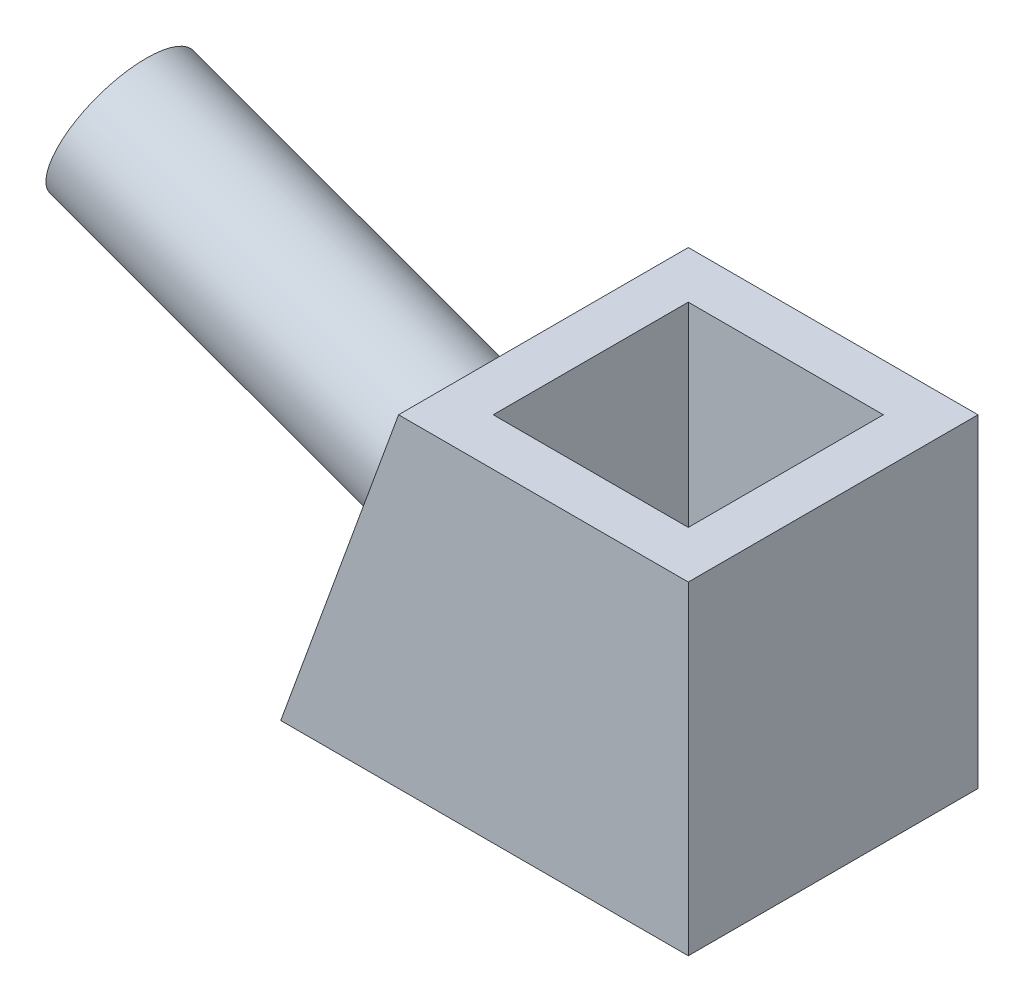
ISO-10303-21;
HEADER;
FILE_DESCRIPTION(('STEP AP214'),'2;1');
FILE_NAME('part.step','',(''),(''),'','','');
FILE_SCHEMA(('AUTOMOTIVE_DESIGN { 1 0 10303 214 1 1 1 1 }'));
ENDSEC;
DATA;
#1=APPLICATION_CONTEXT('core data for automotive mechanical design processes');
#2=APPLICATION_PROTOCOL_DEFINITION('international standard','automotive_design',2000,#1);
#3=PRODUCT_CONTEXT('',#1,'mechanical');
#4=PRODUCT('Part','Part','',(#3));
#5=PRODUCT_RELATED_PRODUCT_CATEGORY('part','',(#4));
#6=PRODUCT_DEFINITION_FORMATION('','',#4);
#7=PRODUCT_DEFINITION_CONTEXT('part definition',#1,'design');
#8=PRODUCT_DEFINITION('design','',#6,#7);
#9=PRODUCT_DEFINITION_SHAPE('','',#8);
#10=(LENGTH_UNIT() NAMED_UNIT(*) SI_UNIT(.MILLI.,.METRE.));
#11=(NAMED_UNIT(*) PLANE_ANGLE_UNIT() SI_UNIT($,.RADIAN.));
#12=(NAMED_UNIT(*) SI_UNIT($,.STERADIAN.) SOLID_ANGLE_UNIT());
#13=UNCERTAINTY_MEASURE_WITH_UNIT(LENGTH_MEASURE(1.E-05),#10,'distance_accuracy_value','');
#14=(GEOMETRIC_REPRESENTATION_CONTEXT(3) GLOBAL_UNCERTAINTY_ASSIGNED_CONTEXT((#13)) GLOBAL_UNIT_ASSIGNED_CONTEXT((#10,
#11,#12)) REPRESENTATION_CONTEXT('',''));
#15=CARTESIAN_POINT('',(0.,0.,0.));
#16=DIRECTION('',(0.,0.,1.));
#17=DIRECTION('',(1.,0.,0.));
#18=AXIS2_PLACEMENT_3D('',#15,#16,#17);
#19=CARTESIAN_POINT('',(0.,42.5694094,0.));
#20=DIRECTION('',(0.,0.,-1.));
#21=DIRECTION('',(-1.,0.,0.));
#22=AXIS2_PLACEMENT_3D('',#19,#20,#21);
#23=PLANE('',#22);
#24=DIRECTION('',(-0.342020143325665,-0.93969262078591,0.));
#25=VECTOR('',#24,1.);
#26=CARTESIAN_POINT('',(1.84384601293396E-06,-6.7110506527837E-07,0.));
#27=LINE('',#26,#25);
#28=CARTESIAN_POINT('',(15.494,42.5694094,0.));
#29=VERTEX_POINT('',#28);
#30=CARTESIAN_POINT('',(0.,0.,0.));
#31=VERTEX_POINT('',#30);
#32=EDGE_CURVE('E139',#29,#31,#27,.T.);
#33=ORIENTED_EDGE('',*,*,#32,.T.);
#34=DIRECTION('',(1.,0.,0.));
#35=VECTOR('',#34,1.);
#36=CARTESIAN_POINT('',(0.,0.,0.));
#37=LINE('',#36,#35);
#38=CARTESIAN_POINT('',(53.594,0.,0.));
#39=VERTEX_POINT('',#38);
#40=EDGE_CURVE('E161',#31,#39,#37,.T.);
#41=ORIENTED_EDGE('',*,*,#40,.T.);
#42=DIRECTION('',(0.,-1.,0.));
#43=VECTOR('',#42,1.);
#44=CARTESIAN_POINT('',(53.594,42.5694094,0.));
#45=LINE('',#44,#43);
#46=CARTESIAN_POINT('',(53.594,42.5694094,0.));
#47=VERTEX_POINT('',#46);
#48=EDGE_CURVE('E42',#47,#39,#45,.T.);
#49=ORIENTED_EDGE('',*,*,#48,.F.);
#50=DIRECTION('',(1.,0.,0.));
#51=VECTOR('',#50,1.);
#52=CARTESIAN_POINT('',(0.,42.5694094,0.));
#53=LINE('',#52,#51);
#54=EDGE_CURVE('E151',#29,#47,#53,.T.);
#55=ORIENTED_EDGE('',*,*,#54,.F.);
#56=EDGE_LOOP('',(#33,#41,#49,#55));
#57=FACE_BOUND('',#56,.T.);
#58=ADVANCED_FACE('F39',(#57),#23,.F.);
#59=CARTESIAN_POINT('',(0.,42.5694094,-38.1));
#60=DIRECTION('',(0.,0.,1.));
#61=DIRECTION('',(1.,0.,0.));
#62=AXIS2_PLACEMENT_3D('',#59,#60,#61);
#63=PLANE('',#62);
#64=DIRECTION('',(-0.342020143325665,-0.93969262078591,0.));
#65=VECTOR('',#64,1.);
#66=CARTESIAN_POINT('',(1.84384601293396E-06,-6.7110506527837E-07,-38.1));
#67=LINE('',#66,#65);
#68=CARTESIAN_POINT('',(15.494,42.5694094,-38.1));
#69=VERTEX_POINT('',#68);
#70=CARTESIAN_POINT('',(0.,0.,-38.1));
#71=VERTEX_POINT('',#70);
#72=EDGE_CURVE('E143',#69,#71,#67,.T.);
#73=ORIENTED_EDGE('',*,*,#72,.F.);
#74=DIRECTION('',(-1.,0.,0.));
#75=VECTOR('',#74,1.);
#76=CARTESIAN_POINT('',(0.,42.5694094,-38.1));
#77=LINE('',#76,#75);
#78=CARTESIAN_POINT('',(53.594,42.5694094,-38.1));
#79=VERTEX_POINT('',#78);
#80=EDGE_CURVE('E156',#79,#69,#77,.T.);
#81=ORIENTED_EDGE('',*,*,#80,.F.);
#82=DIRECTION('',(0.,-1.,0.));
#83=VECTOR('',#82,1.);
#84=CARTESIAN_POINT('',(53.594,42.5694094,-38.1));
#85=LINE('',#84,#83);
#86=CARTESIAN_POINT('',(53.594,0.,-38.1));
#87=VERTEX_POINT('',#86);
#88=EDGE_CURVE('E159',#79,#87,#85,.T.);
#89=ORIENTED_EDGE('',*,*,#88,.T.);
#90=DIRECTION('',(-1.,0.,0.));
#91=VECTOR('',#90,1.);
#92=CARTESIAN_POINT('',(0.,0.,-38.1));
#93=LINE('',#92,#91);
#94=EDGE_CURVE('E154',#87,#71,#93,.T.);
#95=ORIENTED_EDGE('',*,*,#94,.T.);
#96=EDGE_LOOP('',(#73,#81,#89,#95));
#97=FACE_BOUND('',#96,.T.);
#98=ADVANCED_FACE('F182',(#97),#63,.F.);
#99=CARTESIAN_POINT('',(0.,42.5694094,0.));
#100=DIRECTION('',(0.,-1.,0.));
#101=DIRECTION('',(0.,0.,-1.));
#102=AXIS2_PLACEMENT_3D('',#99,#100,#101);
#103=PLANE('',#102);
#104=DIRECTION('',(1.,0.,0.));
#105=VECTOR('',#104,1.);
#106=CARTESIAN_POINT('',(47.371,42.5694094,-6.223));
#107=LINE('',#106,#105);
#108=CARTESIAN_POINT('',(21.717,42.5694094,-6.223));
#109=VERTEX_POINT('',#108);
#110=CARTESIAN_POINT('',(47.371,42.5694094,-6.223));
#111=VERTEX_POINT('',#110);
#112=EDGE_CURVE('E132',#109,#111,#107,.T.);
#113=ORIENTED_EDGE('',*,*,#112,.F.);
#114=DIRECTION('',(0.,0.,1.));
#115=VECTOR('',#114,1.);
#116=CARTESIAN_POINT('',(21.717,42.5694094,-31.877));
#117=LINE('',#116,#115);
#118=CARTESIAN_POINT('',(21.717,42.5694094,-31.877));
#119=VERTEX_POINT('',#118);
#120=EDGE_CURVE('E54',#119,#109,#117,.T.);
#121=ORIENTED_EDGE('',*,*,#120,.F.);
#122=DIRECTION('',(-1.,0.,0.));
#123=VECTOR('',#122,1.);
#124=CARTESIAN_POINT('',(47.371,42.5694094,-31.877));
#125=LINE('',#124,#123);
#126=CARTESIAN_POINT('',(47.371,42.5694094,-31.877));
#127=VERTEX_POINT('',#126);
#128=EDGE_CURVE('E122',#127,#119,#125,.T.);
#129=ORIENTED_EDGE('',*,*,#128,.F.);
#130=DIRECTION('',(0.,0.,-1.));
#131=VECTOR('',#130,1.);
#132=CARTESIAN_POINT('',(47.371,42.5694094,-31.877));
#133=LINE('',#132,#131);
#134=EDGE_CURVE('E125',#111,#127,#133,.T.);
#135=ORIENTED_EDGE('',*,*,#134,.F.);
#136=EDGE_LOOP('',(#113,#121,#129,#135));
#137=FACE_BOUND('',#136,.T.);
#138=DIRECTION('',(0.,0.,1.));
#139=VECTOR('',#138,1.);
#140=CARTESIAN_POINT('',(15.494,42.5694094,-38.1));
#141=LINE('',#140,#139);
#142=EDGE_CURVE('E145',#69,#29,#141,.T.);
#143=ORIENTED_EDGE('',*,*,#142,.T.);
#144=ORIENTED_EDGE('',*,*,#54,.T.);
#145=DIRECTION('',(0.,0.,-1.));
#146=VECTOR('',#145,1.);
#147=CARTESIAN_POINT('',(53.594,42.5694094,0.));
#148=LINE('',#147,#146);
#149=EDGE_CURVE('E153',#47,#79,#148,.T.);
#150=ORIENTED_EDGE('',*,*,#149,.T.);
#151=ORIENTED_EDGE('',*,*,#80,.T.);
#152=EDGE_LOOP('',(#143,#144,#150,#151));
#153=FACE_BOUND('',#152,.T.);
#154=ADVANCED_FACE('F185',(#137,#153),#103,.F.);
#155=CARTESIAN_POINT('',(53.594,42.5694094,0.));
#156=DIRECTION('',(-1.,0.,0.));
#157=DIRECTION('',(0.,0.,1.));
#158=AXIS2_PLACEMENT_3D('',#155,#156,#157);
#159=PLANE('',#158);
#160=DIRECTION('',(0.,0.,-1.));
#161=VECTOR('',#160,1.);
#162=CARTESIAN_POINT('',(53.594,0.,0.));
#163=LINE('',#162,#161);
#164=EDGE_CURVE('E163',#39,#87,#163,.T.);
#165=ORIENTED_EDGE('',*,*,#164,.T.);
#166=ORIENTED_EDGE('',*,*,#88,.F.);
#167=ORIENTED_EDGE('',*,*,#149,.F.);
#168=ORIENTED_EDGE('',*,*,#48,.T.);
#169=EDGE_LOOP('',(#165,#166,#167,#168));
#170=FACE_BOUND('',#169,.T.);
#171=ADVANCED_FACE('F176',(#170),#159,.F.);
#172=CARTESIAN_POINT('',(0.,0.,0.));
#173=DIRECTION('',(0.,-1.,0.));
#174=DIRECTION('',(0.,0.,-1.));
#175=AXIS2_PLACEMENT_3D('',#172,#173,#174);
#176=PLANE('',#175);
#177=DIRECTION('',(0.,0.,1.));
#178=VECTOR('',#177,1.);
#179=CARTESIAN_POINT('',(21.717,0.,-31.877));
#180=LINE('',#179,#178);
#181=CARTESIAN_POINT('',(21.717,0.,-31.877));
#182=VERTEX_POINT('',#181);
#183=CARTESIAN_POINT('',(21.717,0.,-6.223));
#184=VERTEX_POINT('',#183);
#185=EDGE_CURVE('E106',#182,#184,#180,.T.);
#186=ORIENTED_EDGE('',*,*,#185,.T.);
#187=DIRECTION('',(1.,0.,0.));
#188=VECTOR('',#187,1.);
#189=CARTESIAN_POINT('',(47.371,0.,-6.223));
#190=LINE('',#189,#188);
#191=CARTESIAN_POINT('',(47.371,0.,-6.223));
#192=VERTEX_POINT('',#191);
#193=EDGE_CURVE('E115',#184,#192,#190,.T.);
#194=ORIENTED_EDGE('',*,*,#193,.T.);
#195=DIRECTION('',(0.,0.,-1.));
#196=VECTOR('',#195,1.);
#197=CARTESIAN_POINT('',(47.371,0.,-31.877));
#198=LINE('',#197,#196);
#199=CARTESIAN_POINT('',(47.371,0.,-31.877));
#200=VERTEX_POINT('',#199);
#201=EDGE_CURVE('E62',#192,#200,#198,.T.);
#202=ORIENTED_EDGE('',*,*,#201,.T.);
#203=DIRECTION('',(-1.,0.,0.));
#204=VECTOR('',#203,1.);
#205=CARTESIAN_POINT('',(47.371,0.,-31.877));
#206=LINE('',#205,#204);
#207=EDGE_CURVE('E112',#200,#182,#206,.T.);
#208=ORIENTED_EDGE('',*,*,#207,.T.);
#209=EDGE_LOOP('',(#186,#194,#202,#208));
#210=FACE_BOUND('',#209,.T.);
#211=DIRECTION('',(0.,0.,1.));
#212=VECTOR('',#211,1.);
#213=CARTESIAN_POINT('',(0.,0.,0.));
#214=LINE('',#213,#212);
#215=EDGE_CURVE('E150',#71,#31,#214,.T.);
#216=ORIENTED_EDGE('',*,*,#215,.F.);
#217=ORIENTED_EDGE('',*,*,#94,.F.);
#218=ORIENTED_EDGE('',*,*,#164,.F.);
#219=ORIENTED_EDGE('',*,*,#40,.F.);
#220=EDGE_LOOP('',(#216,#217,#218,#219));
#221=FACE_BOUND('',#220,.T.);
#222=ADVANCED_FACE('F119',(#210,#221),#176,.T.);
#223=CARTESIAN_POINT('',(1.84384601293396E-06,-6.7110506527837E-07,-38.1));
#224=DIRECTION('',(-0.93969262078591,0.342020143325665,0.));
#225=DIRECTION('',(-0.342020143325665,-0.93969262078591,0.));
#226=AXIS2_PLACEMENT_3D('',#223,#224,#225);
#227=PLANE('',#226);
#228=CARTESIAN_POINT('',(7.74699907807699,21.2847050355525,-19.05));
#229=DIRECTION('',(-0.93969262078591,0.342020143325666,0.));
#230=DIRECTION('',(-0.342020143325666,-0.93969262078591,0.));
#231=AXIS2_PLACEMENT_3D('',#228,#229,#230);
#232=CIRCLE('',#231,9.4107);
#233=CARTESIAN_POINT('',(10.9656480408718,30.1278703819825,-19.05));
#234=VERTEX_POINT('',#233);
#235=EDGE_CURVE('E11',#234,#234,#232,.T.);
#236=ORIENTED_EDGE('',*,*,#235,.F.);
#237=EDGE_LOOP('',(#236));
#238=FACE_BOUND('',#237,.T.);
#239=ORIENTED_EDGE('',*,*,#32,.F.);
#240=ORIENTED_EDGE('',*,*,#142,.F.);
#241=ORIENTED_EDGE('',*,*,#72,.T.);
#242=ORIENTED_EDGE('',*,*,#215,.T.);
#243=EDGE_LOOP('',(#239,#240,#241,#242));
#244=FACE_BOUND('',#243,.T.);
#245=ADVANCED_FACE('F186',(#238,#244),#227,.T.);
#246=CARTESIAN_POINT('',(21.717,0.,-31.877));
#247=DIRECTION('',(-1.,0.,0.));
#248=DIRECTION('',(0.,0.,1.));
#249=AXIS2_PLACEMENT_3D('',#246,#247,#248);
#250=PLANE('',#249);
#251=ORIENTED_EDGE('',*,*,#120,.T.);
#252=DIRECTION('',(0.,1.,0.));
#253=VECTOR('',#252,1.);
#254=CARTESIAN_POINT('',(21.717,0.,-6.223));
#255=LINE('',#254,#253);
#256=EDGE_CURVE('E102',#184,#109,#255,.T.);
#257=ORIENTED_EDGE('',*,*,#256,.F.);
#258=ORIENTED_EDGE('',*,*,#185,.F.);
#259=DIRECTION('',(0.,1.,0.));
#260=VECTOR('',#259,1.);
#261=CARTESIAN_POINT('',(21.717,0.,-31.877));
#262=LINE('',#261,#260);
#263=EDGE_CURVE('E137',#182,#119,#262,.T.);
#264=ORIENTED_EDGE('',*,*,#263,.T.);
#265=EDGE_LOOP('',(#251,#257,#258,#264));
#266=FACE_BOUND('',#265,.T.);
#267=ADVANCED_FACE('F104',(#266),#250,.F.);
#268=CARTESIAN_POINT('',(47.371,0.,-31.877));
#269=DIRECTION('',(0.,0.,-1.));
#270=DIRECTION('',(-1.,0.,0.));
#271=AXIS2_PLACEMENT_3D('',#268,#269,#270);
#272=PLANE('',#271);
#273=ORIENTED_EDGE('',*,*,#128,.T.);
#274=ORIENTED_EDGE('',*,*,#263,.F.);
#275=ORIENTED_EDGE('',*,*,#207,.F.);
#276=DIRECTION('',(0.,1.,0.));
#277=VECTOR('',#276,1.);
#278=CARTESIAN_POINT('',(47.371,0.,-31.877));
#279=LINE('',#278,#277);
#280=EDGE_CURVE('E140',#200,#127,#279,.T.);
#281=ORIENTED_EDGE('',*,*,#280,.T.);
#282=EDGE_LOOP('',(#273,#274,#275,#281));
#283=FACE_BOUND('',#282,.T.);
#284=ADVANCED_FACE('F194',(#283),#272,.F.);
#285=CARTESIAN_POINT('',(47.371,0.,-31.877));
#286=DIRECTION('',(1.,0.,0.));
#287=DIRECTION('',(0.,0.,-1.));
#288=AXIS2_PLACEMENT_3D('',#285,#286,#287);
#289=PLANE('',#288);
#290=ORIENTED_EDGE('',*,*,#134,.T.);
#291=ORIENTED_EDGE('',*,*,#280,.F.);
#292=ORIENTED_EDGE('',*,*,#201,.F.);
#293=DIRECTION('',(0.,1.,0.));
#294=VECTOR('',#293,1.);
#295=CARTESIAN_POINT('',(47.371,0.,-6.223));
#296=LINE('',#295,#294);
#297=EDGE_CURVE('E111',#192,#111,#296,.T.);
#298=ORIENTED_EDGE('',*,*,#297,.T.);
#299=EDGE_LOOP('',(#290,#291,#292,#298));
#300=FACE_BOUND('',#299,.T.);
#301=ADVANCED_FACE('F238',(#300),#289,.F.);
#302=CARTESIAN_POINT('',(47.371,0.,-6.223));
#303=DIRECTION('',(0.,0.,1.));
#304=DIRECTION('',(1.,0.,0.));
#305=AXIS2_PLACEMENT_3D('',#302,#303,#304);
#306=PLANE('',#305);
#307=ORIENTED_EDGE('',*,*,#112,.T.);
#308=ORIENTED_EDGE('',*,*,#297,.F.);
#309=ORIENTED_EDGE('',*,*,#193,.F.);
#310=ORIENTED_EDGE('',*,*,#256,.T.);
#311=EDGE_LOOP('',(#307,#308,#309,#310));
#312=FACE_BOUND('',#311,.T.);
#313=ADVANCED_FACE('F116',(#312),#306,.F.);
#314=CARTESIAN_POINT('',(-39.9893860578472,38.6593283164963,-19.05));
#315=DIRECTION('',(0.939692620785909,-0.342020143325666,0.));
#316=DIRECTION('',(0.342020143325666,0.93969262078591,0.));
#317=AXIS2_PLACEMENT_3D('',#314,#315,#316);
#318=CYLINDRICAL_SURFACE('',#317,9.4107);
#319=CARTESIAN_POINT('',(-39.9893860578472,38.6593283164963,-19.05));
#320=DIRECTION('',(-0.93969262078591,0.342020143325666,0.));
#321=DIRECTION('',(-0.342020143325666,-0.93969262078591,0.));
#322=AXIS2_PLACEMENT_3D('',#319,#320,#321);
#323=CIRCLE('',#322,9.4107);
#324=CARTESIAN_POINT('',(-36.7707370950524,47.5024936629263,-19.05));
#325=VERTEX_POINT('',#324);
#326=EDGE_CURVE('E133',#325,#325,#323,.T.);
#327=CARTESIAN_POINT('',(-36.7707370950524,47.5024936629263,-19.05));
#328=CARTESIAN_POINT('',(-36.2734830832198,47.3215080037498,-19.05));
#329=CARTESIAN_POINT('',(-35.7762290713873,47.1405223445733,-19.05));
#330=CARTESIAN_POINT('',(-34.7817210477222,46.7785510262203,-19.05));
#331=CARTESIAN_POINT('',(-34.2844670358896,46.5975653670438,-19.05));
#332=CARTESIAN_POINT('',(-33.2899590122246,46.2355940486908,-19.05));
#333=CARTESIAN_POINT('',(-32.792705000392,46.0546083895143,-19.05));
#334=CARTESIAN_POINT('',(-31.7981969767269,45.6926370711613,-19.05));
#335=CARTESIAN_POINT('',(-31.3009429648944,45.5116514119848,-19.05));
#336=CARTESIAN_POINT('',(-30.3064349412293,45.1496800936318,-19.05));
#337=CARTESIAN_POINT('',(-29.8091809293968,44.9686944344553,-19.05));
#338=CARTESIAN_POINT('',(-28.8146729057317,44.6067231161023,-19.05));
#339=CARTESIAN_POINT('',(-28.3174188938991,44.4257374569258,-19.05));
#340=CARTESIAN_POINT('',(-27.322910870234,44.0637661385728,-19.05));
#341=CARTESIAN_POINT('',(-26.8256568584015,43.8827804793964,-19.05));
#342=CARTESIAN_POINT('',(-25.8311488347364,43.5208091610434,-19.05));
#343=CARTESIAN_POINT('',(-25.3338948229039,43.3398235018669,-19.05));
#344=CARTESIAN_POINT('',(-24.3393867992388,42.9778521835139,-19.05));
#345=CARTESIAN_POINT('',(-23.8421327874062,42.7968665243374,-19.05));
#346=CARTESIAN_POINT('',(-22.8476247637411,42.4348952059844,-19.05));
#347=CARTESIAN_POINT('',(-22.3503707519086,42.2539095468079,-19.05));
#348=CARTESIAN_POINT('',(-21.3558627282435,41.8919382284549,-19.05));
#349=CARTESIAN_POINT('',(-20.858608716411,41.7109525692784,-19.05));
#350=CARTESIAN_POINT('',(-19.8641006927459,41.3489812509254,-19.05));
#351=CARTESIAN_POINT('',(-19.3668466809133,41.1679955917489,-19.05));
#352=CARTESIAN_POINT('',(-18.3723386572482,40.8060242733959,-19.05));
#353=CARTESIAN_POINT('',(-17.8750846454157,40.6250386142194,-19.05));
#354=CARTESIAN_POINT('',(-16.8805766217506,40.2630672958664,-19.05));
#355=CARTESIAN_POINT('',(-16.3833226099181,40.0820816366899,-19.05));
#356=CARTESIAN_POINT('',(-15.388814586253,39.7201103183369,-19.05));
#357=CARTESIAN_POINT('',(-14.8915605744204,39.5391246591604,-19.05));
#358=CARTESIAN_POINT('',(-13.8970525507554,39.1771533408074,-19.05));
#359=CARTESIAN_POINT('',(-13.3997985389228,38.9961676816309,-19.05));
#360=CARTESIAN_POINT('',(-12.4052905152577,38.6341963632779,-19.05));
#361=CARTESIAN_POINT('',(-11.9080365034252,38.4532107041014,-19.05));
#362=CARTESIAN_POINT('',(-10.9135284797601,38.0912393857484,-19.05));
#363=CARTESIAN_POINT('',(-10.4162744679276,37.9102537265719,-19.05));
#364=CARTESIAN_POINT('',(-9.42176644426246,37.5482824082189,-19.05));
#365=CARTESIAN_POINT('',(-8.92451243242992,37.3672967490424,-19.05));
#366=CARTESIAN_POINT('',(-7.93000440876483,37.0053254306894,-19.05));
#367=CARTESIAN_POINT('',(-7.43275039693229,36.8243397715129,-19.05));
#368=CARTESIAN_POINT('',(-6.4382423732672,36.4623684531599,-19.05));
#369=CARTESIAN_POINT('',(-5.94098836143465,36.2813827939834,-19.05));
#370=CARTESIAN_POINT('',(-4.94648033776956,35.9194114756304,-19.05));
#371=CARTESIAN_POINT('',(-4.44922632593702,35.7384258164539,-19.05));
#372=CARTESIAN_POINT('',(-3.45471830227193,35.3764544981009,-19.05));
#373=CARTESIAN_POINT('',(-2.95746429043939,35.1954688389244,-19.05));
#374=CARTESIAN_POINT('',(-1.9629562667743,34.8334975205714,-19.05));
#375=CARTESIAN_POINT('',(-1.46570225494176,34.652511861395,-19.05));
#376=CARTESIAN_POINT('',(-0.471194231276672,34.290540543042,-19.05));
#377=CARTESIAN_POINT('',(0.0260597805558715,34.1095548838655,-19.05));
#378=CARTESIAN_POINT('',(1.02056780422096,33.7475835655125,-19.05));
#379=CARTESIAN_POINT('',(1.5178218160535,33.566597906336,-19.05));
#380=CARTESIAN_POINT('',(2.51232983971859,33.204626587983,-19.05));
#381=CARTESIAN_POINT('',(3.00958385155114,33.0236409288065,-19.05));
#382=CARTESIAN_POINT('',(4.00409187521623,32.6616696104535,-19.05));
#383=CARTESIAN_POINT('',(4.50134588704877,32.480683951277,-19.05));
#384=CARTESIAN_POINT('',(5.49585391071385,32.118712632924,-19.05));
#385=CARTESIAN_POINT('',(5.9931079225464,31.9377269737475,-19.05));
#386=CARTESIAN_POINT('',(6.98761594621149,31.5757556553945,-19.05));
#387=CARTESIAN_POINT('',(7.48486995804403,31.394769996218,-19.05));
#388=CARTESIAN_POINT('',(8.47937798170912,31.032798677865,-19.05));
#389=CARTESIAN_POINT('',(8.97663199354166,30.8518130186885,-19.05));
#390=CARTESIAN_POINT('',(9.97114001720675,30.4898417003355,-19.05));
#391=CARTESIAN_POINT('',(10.4683940290393,30.308856041159,-19.05));
#392=CARTESIAN_POINT('',(10.9656480408718,30.1278703819825,-19.05));
#393=B_SPLINE_CURVE_WITH_KNOTS('',3,(#327,#328,#329,#330,#331,#332,#333,#334,#335,#336,#337,
#338,#339,#340,#341,#342,#343,#344,#345,#346,#347,#348,#349,#350,#351,#352,#353,#354,#355,#356,
#357,#358,#359,#360,#361,#362,#363,#364,#365,#366,#367,#368,#369,#370,#371,#372,#373,#374,#375,
#376,#377,#378,#379,#380,#381,#382,#383,#384,#385,#386,#387,#388,#389,#390,#391,#392),
.UNSPECIFIED.,.F.,.F.,(4,2,2,2,2,2,2,2,2,2,2,2,2,2,2,2,2,2,2,2,2,2,2,2,2,2,2,2,2,2,2,2,4),(0.,
1.58749999999999,3.175,4.7625,6.35,7.9375,9.525,11.1125,12.7,14.2875,15.875,17.4625,19.05,
20.6375,22.225,23.8125,25.4,26.9875,28.575,30.1625,31.75,33.3375,34.925,36.5125,38.1,39.6875,
41.275,42.8625,44.45,46.0375,47.625,49.2125,50.8),.UNSPECIFIED.);
#394=EDGE_CURVE('BSEAM257',#325,#234,#393,.T.);
#395=ORIENTED_EDGE('',*,*,#326,.F.);
#396=ORIENTED_EDGE('',*,*,#235,.T.);
#397=ORIENTED_EDGE('',*,*,#394,.T.);
#398=ORIENTED_EDGE('',*,*,#394,.F.);
#399=EDGE_LOOP('',(#395,#397,#396,#398));
#400=FACE_BOUND('',#399,.T.);
#401=ADVANCED_FACE('F257',(#400),#318,.T.);
#402=CARTESIAN_POINT('',(-47.7363851359242,17.3746232809438,0.));
#403=DIRECTION('',(-0.93969262078591,0.342020143325666,0.));
#404=DIRECTION('',(-0.342020143325666,-0.93969262078591,0.));
#405=AXIS2_PLACEMENT_3D('',#402,#403,#404);
#406=PLANE('',#405);
#407=ORIENTED_EDGE('',*,*,#326,.T.);
#408=EDGE_LOOP('',(#407));
#409=FACE_BOUND('',#408,.T.);
#410=ADVANCED_FACE('F273',(#409),#406,.T.);
#411=CLOSED_SHELL('',(#58,#98,#154,#171,#222,#245,#267,#284,#301,#313,#401,#410));
#412=MANIFOLD_SOLID_BREP('B2',#411);
#413=ADVANCED_BREP_SHAPE_REPRESENTATION('',(#18,#412),#14);
#414=SHAPE_DEFINITION_REPRESENTATION(#9,#413);
ENDSEC;
END-ISO-10303-21;
